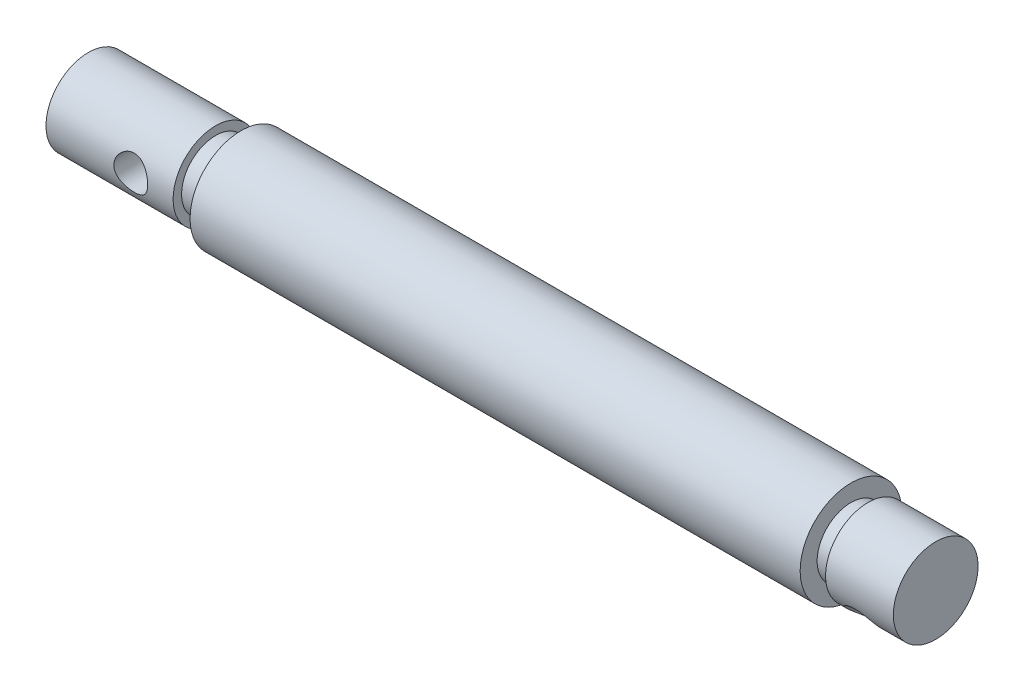
ISO-10303-21;
HEADER;
FILE_DESCRIPTION(('STEP AP214'),'2;1');
FILE_NAME('part.step','',(''),(''),'','','');
FILE_SCHEMA(('AUTOMOTIVE_DESIGN { 1 0 10303 214 1 1 1 1 }'));
ENDSEC;
DATA;
#1=APPLICATION_CONTEXT('core data for automotive mechanical design processes');
#2=APPLICATION_PROTOCOL_DEFINITION('international standard','automotive_design',2000,#1);
#3=PRODUCT_CONTEXT('',#1,'mechanical');
#4=PRODUCT('Part','Part','',(#3));
#5=PRODUCT_RELATED_PRODUCT_CATEGORY('part','',(#4));
#6=PRODUCT_DEFINITION_FORMATION('','',#4);
#7=PRODUCT_DEFINITION_CONTEXT('part definition',#1,'design');
#8=PRODUCT_DEFINITION('design','',#6,#7);
#9=PRODUCT_DEFINITION_SHAPE('','',#8);
#10=(LENGTH_UNIT() NAMED_UNIT(*) SI_UNIT(.MILLI.,.METRE.));
#11=(NAMED_UNIT(*) PLANE_ANGLE_UNIT() SI_UNIT($,.RADIAN.));
#12=(NAMED_UNIT(*) SI_UNIT($,.STERADIAN.) SOLID_ANGLE_UNIT());
#13=UNCERTAINTY_MEASURE_WITH_UNIT(LENGTH_MEASURE(1.E-05),#10,'distance_accuracy_value','');
#14=(GEOMETRIC_REPRESENTATION_CONTEXT(3) GLOBAL_UNCERTAINTY_ASSIGNED_CONTEXT((#13)) GLOBAL_UNIT_ASSIGNED_CONTEXT((#10,
#11,#12)) REPRESENTATION_CONTEXT('',''));
#15=CARTESIAN_POINT('',(0.,0.,0.));
#16=DIRECTION('',(0.,0.,1.));
#17=DIRECTION('',(1.,0.,0.));
#18=AXIS2_PLACEMENT_3D('',#15,#16,#17);
#19=CARTESIAN_POINT('',(0.,0.,0.));
#20=DIRECTION('',(-1.,0.,0.));
#21=DIRECTION('',(0.,0.,1.));
#22=AXIS2_PLACEMENT_3D('',#19,#20,#21);
#23=CYLINDRICAL_SURFACE('',#22,5.);
#24=CARTESIAN_POINT('',(100.,0.,0.));
#25=DIRECTION('',(-1.,0.,0.));
#26=DIRECTION('',(0.,0.,1.));
#27=AXIS2_PLACEMENT_3D('',#24,#25,#26);
#28=CIRCLE('',#27,5.);
#29=CARTESIAN_POINT('',(100.,0.,5.));
#30=VERTEX_POINT('',#29);
#31=EDGE_CURVE('E117',#30,#30,#28,.T.);
#32=ORIENTED_EDGE('',*,*,#31,.T.);
#33=EDGE_LOOP('',(#32));
#34=FACE_BOUND('',#33,.T.);
#35=CARTESIAN_POINT('',(92.,0.,0.));
#36=DIRECTION('',(-1.,0.,0.));
#37=DIRECTION('',(0.,0.,1.));
#38=AXIS2_PLACEMENT_3D('',#35,#36,#37);
#39=CIRCLE('',#38,5.);
#40=CARTESIAN_POINT('',(92.,0.,5.));
#41=VERTEX_POINT('',#40);
#42=EDGE_CURVE('E158',#41,#41,#39,.T.);
#43=ORIENTED_EDGE('',*,*,#42,.F.);
#44=EDGE_LOOP('',(#43));
#45=FACE_BOUND('',#44,.T.);
#46=CARTESIAN_POINT('',(93.431818363598,-4.20006646592293,2.71282957673558));
#47=CARTESIAN_POINT('',(93.4945847992469,-4.23753431179678,2.65482068228785));
#48=CARTESIAN_POINT('',(93.5625367712025,-4.2712783437621,2.5999418857555));
#49=CARTESIAN_POINT('',(93.7068297677996,-4.33187168498129,2.49768595909987));
#50=CARTESIAN_POINT('',(93.7831908464831,-4.3587039795769,2.45032744946355));
#51=CARTESIAN_POINT('',(93.9569687199639,-4.41029593979749,2.35640977289112));
#52=CARTESIAN_POINT('',(94.0556904310918,-4.43379340022512,2.31155899144713));
#53=CARTESIAN_POINT('',(94.2596636137035,-4.47270492061852,2.23533969588001));
#54=CARTESIAN_POINT('',(94.3649150951574,-4.4881189682415,2.2039712023434));
#55=CARTESIAN_POINT('',(94.5894068950938,-4.51254174344823,2.1535643110839));
#56=CARTESIAN_POINT('',(94.7090434769967,-4.52083095599995,2.13592531713704));
#57=CARTESIAN_POINT('',(94.9498941080319,-4.52887557271268,2.11881459784562));
#58=CARTESIAN_POINT('',(95.0711083403607,-4.52862997681495,2.11934500148424));
#59=CARTESIAN_POINT('',(95.3134961574243,-4.51952847214665,2.13868608141659));
#60=CARTESIAN_POINT('',(95.4346443873623,-4.51054951939516,2.15775798651091));
#61=CARTESIAN_POINT('',(95.6717530510501,-4.48335574677379,2.21370264511307));
#62=CARTESIAN_POINT('',(95.7877107089083,-4.46513604772977,2.25058480205656));
#63=CARTESIAN_POINT('',(96.0109354203352,-4.41862223041985,2.34058485943721));
#64=CARTESIAN_POINT('',(96.1182066671325,-4.39033300907631,2.39369486631337));
#65=CARTESIAN_POINT('',(96.3204816883897,-4.32247358073728,2.51415612641238));
#66=CARTESIAN_POINT('',(96.4154984746876,-4.28291548475313,2.58149207061046));
#67=CARTESIAN_POINT('',(96.5696292092969,-4.20148897140781,2.71145223948395));
#68=CARTESIAN_POINT('',(96.632019992346,-4.16211641062793,2.77176152713308));
#69=CARTESIAN_POINT('',(96.7445201545172,-4.07531930595443,2.89786393159534));
#70=CARTESIAN_POINT('',(96.7946367186594,-4.0278995003729,2.96365380983312));
#71=CARTESIAN_POINT('',(96.8803288948187,-3.92457106648982,3.09920130287916));
#72=CARTESIAN_POINT('',(96.9157800604502,-3.8685950954613,3.16898737446373));
#73=CARTESIAN_POINT('',(96.9689475651933,-3.74940566959623,3.30913461171255));
#74=CARTESIAN_POINT('',(96.9866842609862,-3.68620061544733,3.3794950233717));
#75=CARTESIAN_POINT('',(97.0017985557199,-3.56406769656336,3.50772402443311));
#76=CARTESIAN_POINT('',(97.0017164187373,-3.50581312466761,3.56594430851779));
#77=CARTESIAN_POINT('',(96.9874703087322,-3.38741564783824,3.67859826453036));
#78=CARTESIAN_POINT('',(96.9733087039042,-3.32727306211982,3.73303257161959));
#79=CARTESIAN_POINT('',(96.9328720265881,-3.21017738673256,3.8341172128706));
#80=CARTESIAN_POINT('',(96.9072430733317,-3.15321623931275,3.88102152422437));
#81=CARTESIAN_POINT('',(96.8454047496391,-3.04100332838653,3.9695608714172));
#82=CARTESIAN_POINT('',(96.809192873317,-2.9857519731652,4.01119465592027));
#83=CARTESIAN_POINT('',(96.7236432933594,-2.873009717126,4.09281388766671));
#84=CARTESIAN_POINT('',(96.6733680774107,-2.81582849627064,4.13223963601791));
#85=CARTESIAN_POINT('',(96.5636614685321,-2.70644069286508,4.20469883155264));
#86=CARTESIAN_POINT('',(96.5042249379965,-2.65423692839322,4.23772866835451));
#87=CARTESIAN_POINT('',(96.3670503662387,-2.54745800291679,4.30290759516071));
#88=CARTESIAN_POINT('',(96.2879195421019,-2.4939944415065,4.33394763388849));
#89=CARTESIAN_POINT('',(96.121599103722,-2.3966353261818,4.38853713143738));
#90=CARTESIAN_POINT('',(96.034404504582,-2.35274574781526,4.41208191632447));
#91=CARTESIAN_POINT('',(95.8404376736221,-2.26989325312807,4.4553446738982));
#92=CARTESIAN_POINT('',(95.7326850954152,-2.23264136563979,4.47396819000815));
#93=CARTESIAN_POINT('',(95.5119574408587,-2.17360788994582,4.5029448373315));
#94=CARTESIAN_POINT('',(95.3989810794653,-2.15183013015257,4.51329592196379));
#95=CARTESIAN_POINT('',(95.163796183784,-2.12381653307932,4.52655186539439));
#96=CARTESIAN_POINT('',(95.0414389621099,-2.11858537899287,4.5289756691689));
#97=CARTESIAN_POINT('',(94.7974861181655,-2.12675147696749,4.52514576688938));
#98=CARTESIAN_POINT('',(94.6758905439033,-2.14014989165066,4.51889151926118));
#99=CARTESIAN_POINT('',(94.4364022945173,-2.18503035778006,4.49736134870256));
#100=CARTESIAN_POINT('',(94.3185262012583,-2.21658385489894,4.48204977576594));
#101=CARTESIAN_POINT('',(94.0902807365517,-2.29649833436494,4.44163159182381));
#102=CARTESIAN_POINT('',(93.9799163747634,-2.34487040438886,4.41651851781812));
#103=CARTESIAN_POINT('',(93.771065945846,-2.45611849891197,4.35562522266191));
#104=CARTESIAN_POINT('',(93.6724958879648,-2.51888136438084,4.31992762024297));
#105=CARTESIAN_POINT('',(93.4902735557105,-2.65680187006299,4.23649120939868));
#106=CARTESIAN_POINT('',(93.40659523946,-2.73193742147589,4.18877378082303));
#107=CARTESIAN_POINT('',(93.2790725425665,-2.86965846185967,4.09511544747877));
#108=CARTESIAN_POINT('',(93.2305919432836,-2.93006072595559,4.05225407943385));
#109=CARTESIAN_POINT('',(93.1460659345042,-3.05415744988918,3.95955800365033));
#110=CARTESIAN_POINT('',(93.1100104062031,-3.11784918198623,3.90972901695988));
#111=CARTESIAN_POINT('',(93.0521762249627,-3.24688939818108,3.80325373509844));
#112=CARTESIAN_POINT('',(93.0304927490793,-3.31224600797004,3.74656487559428));
#113=CARTESIAN_POINT('',(93.0033557996657,-3.44165158170889,3.6280447671497));
#114=CARTESIAN_POINT('',(92.9978920875312,-3.50570134522258,3.56621678759331));
#115=CARTESIAN_POINT('',(93.0032713839381,-3.62317704293138,3.44657026767546));
#116=CARTESIAN_POINT('',(93.0123944231062,-3.67699833746448,3.38905396025952));
#117=CARTESIAN_POINT('',(93.0432406080894,-3.78026805046136,3.2734664352988));
#118=CARTESIAN_POINT('',(93.0649683507302,-3.82971486600464,3.21539502291508));
#119=CARTESIAN_POINT('',(93.1199376929301,-3.92351988968967,3.10024833312024));
#120=CARTESIAN_POINT('',(93.153224112671,-3.96785738114098,3.04317785543268));
#121=CARTESIAN_POINT('',(93.2297569626106,-4.05084962549776,2.9317981227982));
#122=CARTESIAN_POINT('',(93.2729937629992,-4.08950981392384,2.87748625974843));
#123=CARTESIAN_POINT('',(93.3553659120591,-4.15176366800159,2.78658354442458));
#124=CARTESIAN_POINT('',(93.3925787930321,-4.17664276554999,2.74909488451665));
#125=CARTESIAN_POINT('',(93.431818363598,-4.20006646592293,2.71282957673558));
#126=B_SPLINE_CURVE_WITH_KNOTS('',3,(#46,#47,#48,#49,#50,#51,#52,#53,#54,#55,#56,#57,#58,#59,
#60,#61,#62,#63,#64,#65,#66,#67,#68,#69,#70,#71,#72,#73,#74,#75,#76,#77,#78,#79,#80,#81,#82,#83,
#84,#85,#86,#87,#88,#89,#90,#91,#92,#93,#94,#95,#96,#97,#98,#99,#100,#101,#102,#103,#104,#105,
#106,#107,#108,#109,#110,#111,#112,#113,#114,#115,#116,#117,#118,#119,#120,#121,#122,#123,#124,
#125),.UNSPECIFIED.,.T.,.F.,(4,2,2,2,2,2,2,2,2,2,2,2,2,2,2,2,2,2,2,2,2,2,2,2,2,2,2,2,2,2,2,2,2,
2,2,2,2,2,2,4),(0.,0.279813756539094,0.560309887494529,0.891766074309334,1.22322276723258,
1.58516490674185,1.94714945664822,2.31430898572556,2.68166257955834,3.04883776872104,
3.41561982246059,3.7003621954254,3.98493748680187,4.27188037935846,4.55849314918424,
4.80427748417554,5.05002048474708,5.28338479447754,5.51680440639482,5.773058916196,
6.02945765824566,6.32954489528684,6.62981889756731,6.97487646434963,7.32001937120173,
7.68575232760324,8.05150810945524,8.41871319118549,8.78616081402664,9.150812579774,
9.51482025818297,9.77933104018831,10.0436258963912,10.3096539741428,10.5755140879178,
10.8122643713652,11.0491010499073,11.2868665403693,11.5244028859272,11.6993335081857),.UNSPECIFIED.);
#127=CARTESIAN_POINT('',(93.431818363598,-4.20006646592293,2.71282957673558));
#128=VERTEX_POINT('',#127);
#129=EDGE_CURVE('E11',#128,#128,#126,.T.);
#130=ORIENTED_EDGE('',*,*,#129,.F.);
#131=EDGE_LOOP('',(#130));
#132=FACE_BOUND('',#131,.T.);
#133=ADVANCED_FACE('F39',(#34,#45,#132),#23,.T.);
#134=CARTESIAN_POINT('',(0.,0.,0.));
#135=DIRECTION('',(1.,0.,0.));
#136=DIRECTION('',(0.,0.,-1.));
#137=AXIS2_PLACEMENT_3D('',#134,#135,#136);
#138=PLANE('',#137);
#139=CARTESIAN_POINT('',(0.,0.,0.));
#140=DIRECTION('',(-1.,0.,0.));
#141=DIRECTION('',(0.,0.,1.));
#142=AXIS2_PLACEMENT_3D('',#139,#140,#141);
#143=CIRCLE('',#142,5.);
#144=CARTESIAN_POINT('',(0.,0.,5.));
#145=VERTEX_POINT('',#144);
#146=EDGE_CURVE('E51',#145,#145,#143,.T.);
#147=ORIENTED_EDGE('',*,*,#146,.T.);
#148=EDGE_LOOP('',(#147));
#149=FACE_BOUND('',#148,.T.);
#150=ADVANCED_FACE('F41',(#149),#138,.F.);
#151=CARTESIAN_POINT('',(0.,0.,0.));
#152=DIRECTION('',(-1.,0.,0.));
#153=DIRECTION('',(0.,0.,1.));
#154=AXIS2_PLACEMENT_3D('',#151,#152,#153);
#155=CYLINDRICAL_SURFACE('',#154,5.);
#156=CARTESIAN_POINT('',(12.,0.,5.));
#157=CARTESIAN_POINT('',(11.9999901481763,-0.107493005442891,4.99999271227084));
#158=CARTESIAN_POINT('',(11.9912822479116,-0.215172564090673,4.99649294306932));
#159=CARTESIAN_POINT('',(11.9567522964788,-0.427496480417896,4.98283453100641));
#160=CARTESIAN_POINT('',(11.9308837209139,-0.532131777561248,4.97265778698877));
#161=CARTESIAN_POINT('',(11.8631239219412,-0.734953922727403,4.94674209213118));
#162=CARTESIAN_POINT('',(11.8212851537833,-0.833160661616958,4.93102136364072));
#163=CARTESIAN_POINT('',(11.7229808266735,-1.02107197032837,4.89556610796078));
#164=CARTESIAN_POINT('',(11.6665203450811,-1.11077947675099,4.87583297458057));
#165=CARTESIAN_POINT('',(11.5377645014391,-1.28350100757039,4.83330886170419));
#166=CARTESIAN_POINT('',(11.4648933437597,-1.36606227255021,4.81042296929191));
#167=CARTESIAN_POINT('',(11.3065999965232,-1.51817500478472,4.76460576906194));
#168=CARTESIAN_POINT('',(11.2211717027883,-1.58772010713353,4.74167444453792));
#169=CARTESIAN_POINT('',(11.0355719297577,-1.71487456729288,4.69722791797136));
#170=CARTESIAN_POINT('',(10.9349135139768,-1.77181498119547,4.67582115964951));
#171=CARTESIAN_POINT('',(10.72446360158,-1.86775471903715,4.63833647186792));
#172=CARTESIAN_POINT('',(10.6146764721516,-1.90676256428583,4.62225601244176));
#173=CARTESIAN_POINT('',(10.3942876664079,-1.96389882339587,4.59826357660818));
#174=CARTESIAN_POINT('',(10.2839487644238,-1.98289396580565,4.59001420355605));
#175=CARTESIAN_POINT('',(10.0613650016927,-2.00217296164003,4.58164004049144));
#176=CARTESIAN_POINT('',(9.94912110537498,-2.00246601631322,4.58151125522768));
#177=CARTESIAN_POINT('',(9.73424332854195,-1.98498936750454,4.58910500279994));
#178=CARTESIAN_POINT('',(9.63148428559097,-1.96847531430514,4.5962817503845));
#179=CARTESIAN_POINT('',(9.43034044399328,-1.91994688029782,4.61676187607836));
#180=CARTESIAN_POINT('',(9.33195641188969,-1.88792979480463,4.63006632321673));
#181=CARTESIAN_POINT('',(9.13998216380396,-1.80869473255107,4.6615948508853));
#182=CARTESIAN_POINT('',(9.04653076094531,-1.76117986231532,4.67991379280788));
#183=CARTESIAN_POINT('',(8.86858418363843,-1.65250646073221,4.7193811638989));
#184=CARTESIAN_POINT('',(8.78409239059719,-1.59134280510084,4.74053065456848));
#185=CARTESIAN_POINT('',(8.619590271198,-1.45155059945443,4.78526736742271));
#186=CARTESIAN_POINT('',(8.54043127055398,-1.37193746297063,4.80891664976152));
#187=CARTESIAN_POINT('',(8.39631552199796,-1.20031442743019,4.85459824958282));
#188=CARTESIAN_POINT('',(8.33136160258971,-1.10830206533443,4.87663024445325));
#189=CARTESIAN_POINT('',(8.21638255258417,-0.912077652605842,4.91714681264548));
#190=CARTESIAN_POINT('',(8.16667771880295,-0.807660491346477,4.93555270095415));
#191=CARTESIAN_POINT('',(8.08583213892194,-0.591023765482882,4.96614828328759));
#192=CARTESIAN_POINT('',(8.05468196244259,-0.478808196849674,4.97834113462382));
#193=CARTESIAN_POINT('',(8.01355170458029,-0.25689588760782,4.9945613950691));
#194=CARTESIAN_POINT('',(8.00242754574644,-0.147443293985535,4.99902945833514));
#195=CARTESIAN_POINT('',(7.99828689947138,0.071845309807817,5.00068478510631));
#196=CARTESIAN_POINT('',(8.00526571845249,0.181681213223924,4.99787393582291));
#197=CARTESIAN_POINT('',(8.03629175255199,0.393432739121988,4.98557567063753));
#198=CARTESIAN_POINT('',(8.05955798035097,0.495482491775475,4.97639391345523));
#199=CARTESIAN_POINT('',(8.12143570830981,0.694135428060781,4.952594414055));
#200=CARTESIAN_POINT('',(8.16004917966868,0.790737910224845,4.9379759735653));
#201=CARTESIAN_POINT('',(8.25278493967995,0.979078785816702,4.90416594770812));
#202=CARTESIAN_POINT('',(8.30734547204315,1.07057802275541,4.88484815979803));
#203=CARTESIAN_POINT('',(8.42994032390564,1.24344359124656,4.84373364745525));
#204=CARTESIAN_POINT('',(8.49798004292261,1.32480584076113,4.8219359311027));
#205=CARTESIAN_POINT('',(8.65087001294963,1.48072304302882,4.77645117638112));
#206=CARTESIAN_POINT('',(8.73653354150621,1.55447393380606,4.75273441425052));
#207=CARTESIAN_POINT('',(8.91944008300937,1.68675119741371,4.70741672917132));
#208=CARTESIAN_POINT('',(9.01668500033995,1.74527506133751,4.68581615526511));
#209=CARTESIAN_POINT('',(9.2214616945941,1.84580750193163,4.64714299907708));
#210=CARTESIAN_POINT('',(9.32908399921231,1.88765059453445,4.63011630884788));
#211=CARTESIAN_POINT('',(9.55073365171515,1.9522962197053,4.60323673477931));
#212=CARTESIAN_POINT('',(9.66475620581242,1.97511280526931,4.59337855695998));
#213=CARTESIAN_POINT('',(9.88712790177454,1.9997156172784,4.58271759299926));
#214=CARTESIAN_POINT('',(9.99529483959335,2.00289708230287,4.58131421008171));
#215=CARTESIAN_POINT('',(10.2105448577133,1.99180315927752,4.58614836033098));
#216=CARTESIAN_POINT('',(10.3176280739026,1.97752998791378,4.59238492324793));
#217=CARTESIAN_POINT('',(10.523332189855,1.93307136615365,4.61126649079021));
#218=CARTESIAN_POINT('',(10.622120274433,1.90353749357098,4.62364831827449));
#219=CARTESIAN_POINT('',(10.8133786296135,1.83000544849101,4.65324001232696));
#220=CARTESIAN_POINT('',(10.9058471468998,1.78600328139381,4.67045121206007));
#221=CARTESIAN_POINT('',(11.0876096192708,1.68187276275973,4.70898609604491));
#222=CARTESIAN_POINT('',(11.1764186701305,1.62096533515949,4.73048882313242));
#223=CARTESIAN_POINT('',(11.3429933172038,1.4858921192715,4.77463804372237));
#224=CARTESIAN_POINT('',(11.4207555721283,1.41172233481812,4.79728488048406));
#225=CARTESIAN_POINT('',(11.5682028532636,1.24650550627246,4.84293567087394));
#226=CARTESIAN_POINT('',(11.6370373068981,1.15467600114614,4.86586757962185));
#227=CARTESIAN_POINT('',(11.7583370426216,0.959900320285777,4.90800406713717));
#228=CARTESIAN_POINT('',(11.8107947121525,0.856949004547237,4.92720691092906));
#229=CARTESIAN_POINT('',(11.8966222151903,0.644738062495203,4.95939714815861));
#230=CARTESIAN_POINT('',(11.9303293235603,0.535631618219696,4.97249363055028));
#231=CARTESIAN_POINT('',(11.9786391209543,0.312876546281221,4.99144306209366));
#232=CARTESIAN_POINT('',(11.9933024367439,0.199243525858913,4.99731899495638));
#233=CARTESIAN_POINT('',(11.9993953809783,0.0569122978909295,4.99975899504136));
#234=CARTESIAN_POINT('',(12.0000026086292,0.0284626887407583,5.00000192969176));
#235=CARTESIAN_POINT('',(12.,0.,5.));
#236=B_SPLINE_CURVE_WITH_KNOTS('',3,(#156,#157,#158,#159,#160,#161,#162,#163,#164,#165,#166,
#167,#168,#169,#170,#171,#172,#173,#174,#175,#176,#177,#178,#179,#180,#181,#182,#183,#184,#185,
#186,#187,#188,#189,#190,#191,#192,#193,#194,#195,#196,#197,#198,#199,#200,#201,#202,#203,#204,
#205,#206,#207,#208,#209,#210,#211,#212,#213,#214,#215,#216,#217,#218,#219,#220,#221,#222,#223,
#224,#225,#226,#227,#228,#229,#230,#231,#232,#233,#234,#235),.UNSPECIFIED.,.T.,.F.,(4,2,2,2,2,2,
2,2,2,2,2,2,2,2,2,2,2,2,2,2,2,2,2,2,2,2,2,2,2,2,2,2,2,2,2,2,2,2,2,4),(0.,0.322402987893071,
0.645683636007934,0.96791145747158,1.29002753567984,1.62597381700397,1.96208394934411,
2.31315258819217,2.66405423118268,2.99904105308829,3.33386306340488,3.64538328401372,
3.95695787256047,4.27489126298816,4.59294421938183,4.93558349186557,5.27829092839732,
5.62776913162806,5.9770695611379,6.30569184528007,6.63422893570082,6.94800455564365,
7.26182048993796,7.58523513398262,7.90877959498969,8.25368474624413,8.59864669043748,
8.94695045140827,9.29499672645933,9.61799673392748,9.94095572563045,10.2511431854877,
10.5614163580516,10.8894546805669,11.2175920134839,11.5670042353384,11.9165786364053,
12.2596430101332,12.6016125240434,12.686980458968),.UNSPECIFIED.);
#237=CARTESIAN_POINT('',(12.,0.,5.));
#238=VERTEX_POINT('',#237);
#239=EDGE_CURVE('E112',#238,#238,#236,.T.);
#240=ORIENTED_EDGE('',*,*,#239,.T.);
#241=EDGE_LOOP('',(#240));
#242=FACE_BOUND('',#241,.T.);
#243=CARTESIAN_POINT('',(12.,0.,-5.));
#244=CARTESIAN_POINT('',(11.9999901481763,0.107493005442891,-4.99999271227084));
#245=CARTESIAN_POINT('',(11.9912822479116,0.215172564090673,-4.99649294306932));
#246=CARTESIAN_POINT('',(11.9567522964788,0.427496480417896,-4.98283453100641));
#247=CARTESIAN_POINT('',(11.9308837209139,0.532131777561248,-4.97265778698877));
#248=CARTESIAN_POINT('',(11.8631239219412,0.734953922727403,-4.94674209213118));
#249=CARTESIAN_POINT('',(11.8212851537833,0.833160661616958,-4.93102136364072));
#250=CARTESIAN_POINT('',(11.7229808266735,1.02107197032837,-4.89556610796078));
#251=CARTESIAN_POINT('',(11.6665203450811,1.11077947675099,-4.87583297458057));
#252=CARTESIAN_POINT('',(11.5377645014391,1.28350100757039,-4.83330886170419));
#253=CARTESIAN_POINT('',(11.4648933437597,1.36606227255021,-4.81042296929191));
#254=CARTESIAN_POINT('',(11.3065999965232,1.51817500478472,-4.76460576906194));
#255=CARTESIAN_POINT('',(11.2211717027883,1.58772010713353,-4.74167444453792));
#256=CARTESIAN_POINT('',(11.0355719297577,1.71487456729288,-4.69722791797136));
#257=CARTESIAN_POINT('',(10.9349135139768,1.77181498119547,-4.67582115964951));
#258=CARTESIAN_POINT('',(10.72446360158,1.86775471903715,-4.63833647186792));
#259=CARTESIAN_POINT('',(10.6146764721516,1.90676256428583,-4.62225601244176));
#260=CARTESIAN_POINT('',(10.3942876664079,1.96389882339587,-4.59826357660818));
#261=CARTESIAN_POINT('',(10.2839487644238,1.98289396580565,-4.59001420355605));
#262=CARTESIAN_POINT('',(10.0613650016927,2.00217296164003,-4.58164004049144));
#263=CARTESIAN_POINT('',(9.94912110537498,2.00246601631322,-4.58151125522768));
#264=CARTESIAN_POINT('',(9.73424332854195,1.98498936750454,-4.58910500279994));
#265=CARTESIAN_POINT('',(9.63148428559097,1.96847531430514,-4.5962817503845));
#266=CARTESIAN_POINT('',(9.43034044399328,1.91994688029782,-4.61676187607836));
#267=CARTESIAN_POINT('',(9.33195641188969,1.88792979480463,-4.63006632321673));
#268=CARTESIAN_POINT('',(9.13998216380396,1.80869473255107,-4.6615948508853));
#269=CARTESIAN_POINT('',(9.04653076094531,1.76117986231532,-4.67991379280788));
#270=CARTESIAN_POINT('',(8.86858418363843,1.65250646073221,-4.7193811638989));
#271=CARTESIAN_POINT('',(8.78409239059719,1.59134280510084,-4.74053065456848));
#272=CARTESIAN_POINT('',(8.619590271198,1.45155059945443,-4.78526736742271));
#273=CARTESIAN_POINT('',(8.54043127055398,1.37193746297063,-4.80891664976152));
#274=CARTESIAN_POINT('',(8.39631552199796,1.20031442743019,-4.85459824958282));
#275=CARTESIAN_POINT('',(8.33136160258971,1.10830206533443,-4.87663024445325));
#276=CARTESIAN_POINT('',(8.21638255258417,0.912077652605842,-4.91714681264548));
#277=CARTESIAN_POINT('',(8.16667771880295,0.807660491346477,-4.93555270095415));
#278=CARTESIAN_POINT('',(8.08583213892194,0.591023765482882,-4.96614828328759));
#279=CARTESIAN_POINT('',(8.05468196244259,0.478808196849674,-4.97834113462382));
#280=CARTESIAN_POINT('',(8.01355170458029,0.25689588760782,-4.9945613950691));
#281=CARTESIAN_POINT('',(8.00242754574644,0.147443293985535,-4.99902945833514));
#282=CARTESIAN_POINT('',(7.99828689947138,-0.071845309807817,-5.00068478510631));
#283=CARTESIAN_POINT('',(8.00526571845249,-0.181681213223924,-4.99787393582291));
#284=CARTESIAN_POINT('',(8.03629175255199,-0.393432739121988,-4.98557567063753));
#285=CARTESIAN_POINT('',(8.05955798035097,-0.495482491775475,-4.97639391345523));
#286=CARTESIAN_POINT('',(8.12143570830981,-0.694135428060781,-4.952594414055));
#287=CARTESIAN_POINT('',(8.16004917966868,-0.790737910224845,-4.9379759735653));
#288=CARTESIAN_POINT('',(8.25278493967995,-0.979078785816702,-4.90416594770812));
#289=CARTESIAN_POINT('',(8.30734547204315,-1.07057802275541,-4.88484815979803));
#290=CARTESIAN_POINT('',(8.42994032390564,-1.24344359124656,-4.84373364745525));
#291=CARTESIAN_POINT('',(8.49798004292261,-1.32480584076113,-4.8219359311027));
#292=CARTESIAN_POINT('',(8.65087001294963,-1.48072304302882,-4.77645117638112));
#293=CARTESIAN_POINT('',(8.73653354150621,-1.55447393380606,-4.75273441425052));
#294=CARTESIAN_POINT('',(8.91944008300937,-1.68675119741371,-4.70741672917132));
#295=CARTESIAN_POINT('',(9.01668500033995,-1.74527506133751,-4.68581615526511));
#296=CARTESIAN_POINT('',(9.2214616945941,-1.84580750193163,-4.64714299907708));
#297=CARTESIAN_POINT('',(9.32908399921231,-1.88765059453445,-4.63011630884788));
#298=CARTESIAN_POINT('',(9.55073365171515,-1.9522962197053,-4.60323673477931));
#299=CARTESIAN_POINT('',(9.66475620581242,-1.97511280526931,-4.59337855695998));
#300=CARTESIAN_POINT('',(9.88712790177454,-1.9997156172784,-4.58271759299926));
#301=CARTESIAN_POINT('',(9.99529483959335,-2.00289708230287,-4.58131421008171));
#302=CARTESIAN_POINT('',(10.2105448577133,-1.99180315927752,-4.58614836033098));
#303=CARTESIAN_POINT('',(10.3176280739026,-1.97752998791378,-4.59238492324793));
#304=CARTESIAN_POINT('',(10.523332189855,-1.93307136615365,-4.61126649079021));
#305=CARTESIAN_POINT('',(10.622120274433,-1.90353749357098,-4.62364831827449));
#306=CARTESIAN_POINT('',(10.8133786296135,-1.83000544849101,-4.65324001232696));
#307=CARTESIAN_POINT('',(10.9058471468998,-1.78600328139381,-4.67045121206007));
#308=CARTESIAN_POINT('',(11.0876096192708,-1.68187276275973,-4.70898609604491));
#309=CARTESIAN_POINT('',(11.1764186701305,-1.62096533515949,-4.73048882313242));
#310=CARTESIAN_POINT('',(11.3429933172038,-1.4858921192715,-4.77463804372237));
#311=CARTESIAN_POINT('',(11.4207555721283,-1.41172233481812,-4.79728488048406));
#312=CARTESIAN_POINT('',(11.5682028532636,-1.24650550627246,-4.84293567087394));
#313=CARTESIAN_POINT('',(11.6370373068981,-1.15467600114614,-4.86586757962185));
#314=CARTESIAN_POINT('',(11.7583370426216,-0.959900320285777,-4.90800406713717));
#315=CARTESIAN_POINT('',(11.8107947121525,-0.856949004547237,-4.92720691092906));
#316=CARTESIAN_POINT('',(11.8966222151903,-0.644738062495203,-4.95939714815861));
#317=CARTESIAN_POINT('',(11.9303293235603,-0.535631618219696,-4.97249363055028));
#318=CARTESIAN_POINT('',(11.9786391209543,-0.312876546281221,-4.99144306209366));
#319=CARTESIAN_POINT('',(11.9933024367439,-0.199243525858913,-4.99731899495638));
#320=CARTESIAN_POINT('',(11.9993953809783,-0.0569122978909295,-4.99975899504136));
#321=CARTESIAN_POINT('',(12.0000026086292,-0.0284626887407583,-5.00000192969176));
#322=CARTESIAN_POINT('',(12.,0.,-5.));
#323=B_SPLINE_CURVE_WITH_KNOTS('',3,(#243,#244,#245,#246,#247,#248,#249,#250,#251,#252,#253,
#254,#255,#256,#257,#258,#259,#260,#261,#262,#263,#264,#265,#266,#267,#268,#269,#270,#271,#272,
#273,#274,#275,#276,#277,#278,#279,#280,#281,#282,#283,#284,#285,#286,#287,#288,#289,#290,#291,
#292,#293,#294,#295,#296,#297,#298,#299,#300,#301,#302,#303,#304,#305,#306,#307,#308,#309,#310,
#311,#312,#313,#314,#315,#316,#317,#318,#319,#320,#321,#322),.UNSPECIFIED.,.T.,.F.,(4,2,2,2,2,2,
2,2,2,2,2,2,2,2,2,2,2,2,2,2,2,2,2,2,2,2,2,2,2,2,2,2,2,2,2,2,2,2,2,4),(0.,0.322402987893071,
0.645683636007934,0.96791145747158,1.29002753567984,1.62597381700397,1.96208394934411,
2.31315258819217,2.66405423118268,2.99904105308829,3.33386306340488,3.64538328401372,
3.95695787256047,4.27489126298816,4.59294421938183,4.93558349186557,5.27829092839732,
5.62776913162806,5.9770695611379,6.30569184528007,6.63422893570082,6.94800455564365,
7.26182048993796,7.58523513398262,7.90877959498969,8.25368474624413,8.59864669043748,
8.94695045140827,9.29499672645933,9.61799673392748,9.94095572563045,10.2511431854877,
10.5614163580516,10.8894546805669,11.2175920134839,11.5670042353384,11.9165786364053,
12.2596430101332,12.6016125240434,12.686980458968),.UNSPECIFIED.);
#324=CARTESIAN_POINT('',(12.,0.,-5.));
#325=VERTEX_POINT('',#324);
#326=EDGE_CURVE('E107',#325,#325,#323,.T.);
#327=ORIENTED_EDGE('',*,*,#326,.T.);
#328=EDGE_LOOP('',(#327));
#329=FACE_BOUND('',#328,.T.);
#330=ORIENTED_EDGE('',*,*,#146,.F.);
#331=EDGE_LOOP('',(#330));
#332=FACE_BOUND('',#331,.T.);
#333=CARTESIAN_POINT('',(15.,0.,0.));
#334=DIRECTION('',(-1.,0.,0.));
#335=DIRECTION('',(0.,0.,1.));
#336=AXIS2_PLACEMENT_3D('',#333,#334,#335);
#337=CIRCLE('',#336,5.);
#338=CARTESIAN_POINT('',(15.,0.,5.));
#339=VERTEX_POINT('',#338);
#340=EDGE_CURVE('E137',#339,#339,#337,.T.);
#341=ORIENTED_EDGE('',*,*,#340,.T.);
#342=EDGE_LOOP('',(#341));
#343=FACE_BOUND('',#342,.T.);
#344=ADVANCED_FACE('F66',(#242,#329,#332,#343),#155,.T.);
#345=CARTESIAN_POINT('',(15.,5.,0.));
#346=DIRECTION('',(-1.,0.,0.));
#347=DIRECTION('',(0.,0.,1.));
#348=AXIS2_PLACEMENT_3D('',#345,#346,#347);
#349=PLANE('',#348);
#350=ORIENTED_EDGE('',*,*,#340,.F.);
#351=EDGE_LOOP('',(#350));
#352=FACE_BOUND('',#351,.T.);
#353=CARTESIAN_POINT('',(15.,0.,0.));
#354=DIRECTION('',(-1.,0.,0.));
#355=DIRECTION('',(0.,0.,1.));
#356=AXIS2_PLACEMENT_3D('',#353,#354,#355);
#357=CIRCLE('',#356,4.);
#358=CARTESIAN_POINT('',(15.,0.,4.));
#359=VERTEX_POINT('',#358);
#360=EDGE_CURVE('E138',#359,#359,#357,.T.);
#361=ORIENTED_EDGE('',*,*,#360,.T.);
#362=EDGE_LOOP('',(#361));
#363=FACE_BOUND('',#362,.T.);
#364=ADVANCED_FACE('F98',(#352,#363),#349,.F.);
#365=CARTESIAN_POINT('',(0.,0.,0.));
#366=DIRECTION('',(-1.,0.,0.));
#367=DIRECTION('',(0.,0.,1.));
#368=AXIS2_PLACEMENT_3D('',#365,#366,#367);
#369=CYLINDRICAL_SURFACE('',#368,4.);
#370=ORIENTED_EDGE('',*,*,#360,.F.);
#371=EDGE_LOOP('',(#370));
#372=FACE_BOUND('',#371,.T.);
#373=CARTESIAN_POINT('',(18.,0.,0.));
#374=DIRECTION('',(-1.,0.,0.));
#375=DIRECTION('',(0.,0.,1.));
#376=AXIS2_PLACEMENT_3D('',#373,#374,#375);
#377=CIRCLE('',#376,4.);
#378=CARTESIAN_POINT('',(18.,0.,4.));
#379=VERTEX_POINT('',#378);
#380=EDGE_CURVE('E141',#379,#379,#377,.T.);
#381=ORIENTED_EDGE('',*,*,#380,.T.);
#382=EDGE_LOOP('',(#381));
#383=FACE_BOUND('',#382,.T.);
#384=ADVANCED_FACE('F94',(#372,#383),#369,.T.);
#385=CARTESIAN_POINT('',(18.,4.,0.));
#386=DIRECTION('',(1.,0.,0.));
#387=DIRECTION('',(0.,0.,-1.));
#388=AXIS2_PLACEMENT_3D('',#385,#386,#387);
#389=PLANE('',#388);
#390=ORIENTED_EDGE('',*,*,#380,.F.);
#391=EDGE_LOOP('',(#390));
#392=FACE_BOUND('',#391,.T.);
#393=CARTESIAN_POINT('',(18.,0.,0.));
#394=DIRECTION('',(-1.,0.,0.));
#395=DIRECTION('',(0.,0.,1.));
#396=AXIS2_PLACEMENT_3D('',#393,#394,#395);
#397=CIRCLE('',#396,6.);
#398=CARTESIAN_POINT('',(18.,0.,6.));
#399=VERTEX_POINT('',#398);
#400=EDGE_CURVE('E146',#399,#399,#397,.T.);
#401=ORIENTED_EDGE('',*,*,#400,.T.);
#402=EDGE_LOOP('',(#401));
#403=FACE_BOUND('',#402,.T.);
#404=ADVANCED_FACE('F90',(#392,#403),#389,.F.);
#405=CARTESIAN_POINT('',(0.,0.,0.));
#406=DIRECTION('',(-1.,0.,0.));
#407=DIRECTION('',(0.,0.,1.));
#408=AXIS2_PLACEMENT_3D('',#405,#406,#407);
#409=CYLINDRICAL_SURFACE('',#408,6.);
#410=ORIENTED_EDGE('',*,*,#400,.F.);
#411=EDGE_LOOP('',(#410));
#412=FACE_BOUND('',#411,.T.);
#413=CARTESIAN_POINT('',(90.,0.,0.));
#414=DIRECTION('',(-1.,0.,0.));
#415=DIRECTION('',(0.,0.,1.));
#416=AXIS2_PLACEMENT_3D('',#413,#414,#415);
#417=CIRCLE('',#416,6.);
#418=CARTESIAN_POINT('',(90.,0.,6.));
#419=VERTEX_POINT('',#418);
#420=EDGE_CURVE('E149',#419,#419,#417,.T.);
#421=ORIENTED_EDGE('',*,*,#420,.T.);
#422=EDGE_LOOP('',(#421));
#423=FACE_BOUND('',#422,.T.);
#424=ADVANCED_FACE('F86',(#412,#423),#409,.T.);
#425=CARTESIAN_POINT('',(90.,6.,0.));
#426=DIRECTION('',(-1.,0.,0.));
#427=DIRECTION('',(0.,0.,1.));
#428=AXIS2_PLACEMENT_3D('',#425,#426,#427);
#429=PLANE('',#428);
#430=ORIENTED_EDGE('',*,*,#420,.F.);
#431=EDGE_LOOP('',(#430));
#432=FACE_BOUND('',#431,.T.);
#433=CARTESIAN_POINT('',(90.,0.,0.));
#434=DIRECTION('',(-1.,0.,0.));
#435=DIRECTION('',(0.,0.,1.));
#436=AXIS2_PLACEMENT_3D('',#433,#434,#435);
#437=CIRCLE('',#436,4.);
#438=CARTESIAN_POINT('',(90.,0.,4.));
#439=VERTEX_POINT('',#438);
#440=EDGE_CURVE('E152',#439,#439,#437,.T.);
#441=ORIENTED_EDGE('',*,*,#440,.T.);
#442=EDGE_LOOP('',(#441));
#443=FACE_BOUND('',#442,.T.);
#444=ADVANCED_FACE('F82',(#432,#443),#429,.F.);
#445=CARTESIAN_POINT('',(0.,0.,0.));
#446=DIRECTION('',(-1.,0.,0.));
#447=DIRECTION('',(0.,0.,1.));
#448=AXIS2_PLACEMENT_3D('',#445,#446,#447);
#449=CYLINDRICAL_SURFACE('',#448,4.);
#450=ORIENTED_EDGE('',*,*,#440,.F.);
#451=EDGE_LOOP('',(#450));
#452=FACE_BOUND('',#451,.T.);
#453=CARTESIAN_POINT('',(92.,0.,0.));
#454=DIRECTION('',(-1.,0.,0.));
#455=DIRECTION('',(0.,0.,1.));
#456=AXIS2_PLACEMENT_3D('',#453,#454,#455);
#457=CIRCLE('',#456,4.);
#458=CARTESIAN_POINT('',(92.,0.,4.));
#459=VERTEX_POINT('',#458);
#460=EDGE_CURVE('E155',#459,#459,#457,.T.);
#461=ORIENTED_EDGE('',*,*,#460,.T.);
#462=EDGE_LOOP('',(#461));
#463=FACE_BOUND('',#462,.T.);
#464=ADVANCED_FACE('F78',(#452,#463),#449,.T.);
#465=CARTESIAN_POINT('',(92.,4.,0.));
#466=DIRECTION('',(1.,0.,0.));
#467=DIRECTION('',(0.,0.,-1.));
#468=AXIS2_PLACEMENT_3D('',#465,#466,#467);
#469=PLANE('',#468);
#470=ORIENTED_EDGE('',*,*,#460,.F.);
#471=EDGE_LOOP('',(#470));
#472=FACE_BOUND('',#471,.T.);
#473=ORIENTED_EDGE('',*,*,#42,.T.);
#474=EDGE_LOOP('',(#473));
#475=FACE_BOUND('',#474,.T.);
#476=ADVANCED_FACE('F75',(#472,#475),#469,.F.);
#477=CARTESIAN_POINT('',(100.,5.,0.));
#478=DIRECTION('',(-1.,0.,0.));
#479=DIRECTION('',(0.,0.,1.));
#480=AXIS2_PLACEMENT_3D('',#477,#478,#479);
#481=PLANE('',#480);
#482=ORIENTED_EDGE('',*,*,#31,.F.);
#483=EDGE_LOOP('',(#482));
#484=FACE_BOUND('',#483,.T.);
#485=ADVANCED_FACE('F73',(#484),#481,.F.);
#486=CARTESIAN_POINT('',(10.,0.,-6.));
#487=DIRECTION('',(0.,0.,1.));
#488=DIRECTION('',(1.,0.,0.));
#489=AXIS2_PLACEMENT_3D('',#486,#487,#488);
#490=CYLINDRICAL_SURFACE('',#489,2.);
#491=ORIENTED_EDGE('',*,*,#326,.F.);
#492=EDGE_LOOP('',(#491));
#493=FACE_BOUND('',#492,.T.);
#494=ORIENTED_EDGE('',*,*,#239,.F.);
#495=EDGE_LOOP('',(#494));
#496=FACE_BOUND('',#495,.T.);
#497=ADVANCED_FACE('F57',(#493,#496),#490,.F.);
#498=CARTESIAN_POINT('',(95.,-3.53553390593274,3.53553390593273));
#499=DIRECTION('',(0.,-0.707106781186549,0.707106781186546));
#500=DIRECTION('',(0.,-0.707106781186546,-0.707106781186549));
#501=AXIS2_PLACEMENT_3D('',#498,#499,#500);
#502=CONICAL_SURFACE('',#501,2.,0.785398163397443);
#503=CARTESIAN_POINT('',(95.,-2.12132034355963,2.12132034355962));
#504=VERTEX_POINT('',#503);
#505=VERTEX_LOOP('',#504);
#506=FACE_BOUND('',#505,.T.);
#507=ORIENTED_EDGE('',*,*,#129,.T.);
#508=EDGE_LOOP('',(#507));
#509=FACE_BOUND('',#508,.T.);
#510=ADVANCED_FACE('F54',(#506,#509),#502,.F.);
#511=CLOSED_SHELL('',(#133,#150,#344,#364,#384,#404,#424,#444,#464,#476,#485,#497,#510));
#512=MANIFOLD_SOLID_BREP('B2',#511);
#513=ADVANCED_BREP_SHAPE_REPRESENTATION('',(#18,#512),#14);
#514=SHAPE_DEFINITION_REPRESENTATION(#9,#513);
ENDSEC;
END-ISO-10303-21;
